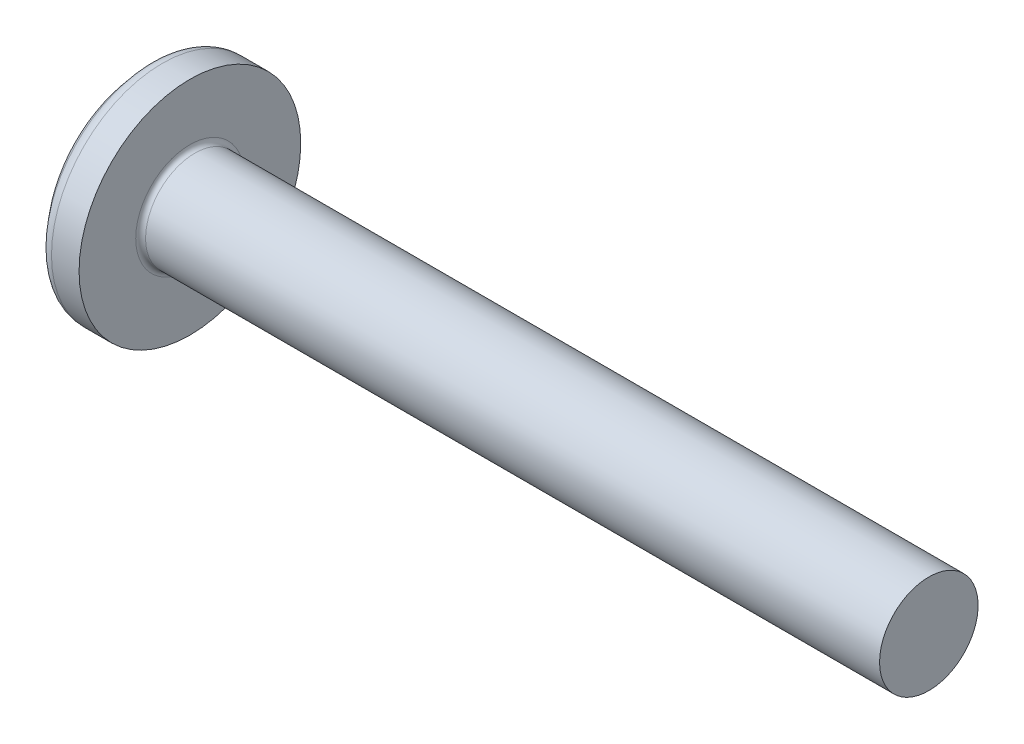
ISO-10303-21;
HEADER;
FILE_DESCRIPTION(('STEP AP214'),'2;1');
FILE_NAME('part.step','',(''),(''),'','','');
FILE_SCHEMA(('AUTOMOTIVE_DESIGN { 1 0 10303 214 1 1 1 1 }'));
ENDSEC;
DATA;
#1=APPLICATION_CONTEXT('core data for automotive mechanical design processes');
#2=APPLICATION_PROTOCOL_DEFINITION('international standard','automotive_design',2000,#1);
#3=PRODUCT_CONTEXT('',#1,'mechanical');
#4=PRODUCT('Part','Part','',(#3));
#5=PRODUCT_RELATED_PRODUCT_CATEGORY('part','',(#4));
#6=PRODUCT_DEFINITION_FORMATION('','',#4);
#7=PRODUCT_DEFINITION_CONTEXT('part definition',#1,'design');
#8=PRODUCT_DEFINITION('design','',#6,#7);
#9=PRODUCT_DEFINITION_SHAPE('','',#8);
#10=(LENGTH_UNIT() NAMED_UNIT(*) SI_UNIT(.MILLI.,.METRE.));
#11=(NAMED_UNIT(*) PLANE_ANGLE_UNIT() SI_UNIT($,.RADIAN.));
#12=(NAMED_UNIT(*) SI_UNIT($,.STERADIAN.) SOLID_ANGLE_UNIT());
#13=UNCERTAINTY_MEASURE_WITH_UNIT(LENGTH_MEASURE(1.E-05),#10,'distance_accuracy_value','');
#14=(GEOMETRIC_REPRESENTATION_CONTEXT(3) GLOBAL_UNCERTAINTY_ASSIGNED_CONTEXT((#13)) GLOBAL_UNIT_ASSIGNED_CONTEXT((#10,
#11,#12)) REPRESENTATION_CONTEXT('',''));
#15=CARTESIAN_POINT('',(0.,0.,0.));
#16=DIRECTION('',(0.,0.,1.));
#17=DIRECTION('',(1.,0.,0.));
#18=AXIS2_PLACEMENT_3D('',#15,#16,#17);
#19=CARTESIAN_POINT('',(3.2,0.,0.));
#20=DIRECTION('',(-1.,0.,0.));
#21=DIRECTION('',(0.,1.,0.));
#22=AXIS2_PLACEMENT_3D('',#19,#20,#21);
#23=SPHERICAL_SURFACE('',#22,3.2);
#24=CARTESIAN_POINT('',(0.841233741586119,0.,0.));
#25=DIRECTION('',(-1.,0.,0.));
#26=DIRECTION('',(0.,0.,1.));
#27=AXIS2_PLACEMENT_3D('',#24,#25,#26);
#28=CIRCLE('',#27,2.16245733788396);
#29=CARTESIAN_POINT('',(0.841233741586119,0.,2.16245733788396));
#30=VERTEX_POINT('',#29);
#31=EDGE_CURVE('E237',#30,#30,#28,.T.);
#32=ORIENTED_EDGE('',*,*,#31,.T.);
#33=EDGE_LOOP('',(#32));
#34=FACE_BOUND('',#33,.T.);
#35=CARTESIAN_POINT('',(0.0716483709574333,0.,0.));
#36=DIRECTION('',(1.,0.,0.));
#37=DIRECTION('',(0.,0.,-1.));
#38=AXIS2_PLACEMENT_3D('',#35,#36,#37);
#39=CIRCLE('',#38,0.673361778739132);
#40=CARTESIAN_POINT('',(0.0716483709574344,-0.369999999999998,-0.562597622699144));
#41=VERTEX_POINT('',#40);
#42=CARTESIAN_POINT('',(0.0716483709574333,-0.56259762269914,-0.37));
#43=VERTEX_POINT('',#42);
#44=EDGE_CURVE('E373',#41,#43,#39,.F.);
#45=ORIENTED_EDGE('',*,*,#44,.F.);
#46=CARTESIAN_POINT('',(3.2,-0.37,0.));
#47=DIRECTION('',(0.,1.,0.));
#48=DIRECTION('',(0.,0.,1.));
#49=AXIS2_PLACEMENT_3D('',#46,#47,#48);
#50=CIRCLE('',#49,3.17853739949682);
#51=CARTESIAN_POINT('',(0.155263655884902,-0.369999999999996,-0.912513339532436));
#52=VERTEX_POINT('',#51);
#53=EDGE_CURVE('E299',#52,#41,#50,.T.);
#54=ORIENTED_EDGE('',*,*,#53,.F.);
#55=CARTESIAN_POINT('',(3.24047110948155,0.,-0.16762475871276));
#56=DIRECTION('',(0.234695116100391,0.,-0.972069031745495));
#57=DIRECTION('',(-0.972069031745495,0.,-0.234695116100391));
#58=AXIS2_PLACEMENT_3D('',#55,#56,#57);
#59=CIRCLE('',#58,3.19535037665102);
#60=CARTESIAN_POINT('',(0.155263655884902,0.370000000000003,-0.912513339532433));
#61=VERTEX_POINT('',#60);
#62=EDGE_CURVE('E271',#52,#61,#59,.T.);
#63=ORIENTED_EDGE('',*,*,#62,.T.);
#64=CARTESIAN_POINT('',(3.2,0.37,0.));
#65=DIRECTION('',(0.,-1.,0.));
#66=DIRECTION('',(0.,0.,-1.));
#67=AXIS2_PLACEMENT_3D('',#64,#65,#66);
#68=CIRCLE('',#67,3.17853739949682);
#69=CARTESIAN_POINT('',(0.0716483709574348,0.370000000000002,-0.562597622699142));
#70=VERTEX_POINT('',#69);
#71=EDGE_CURVE('E326',#70,#61,#68,.T.);
#72=ORIENTED_EDGE('',*,*,#71,.F.);
#73=CARTESIAN_POINT('',(0.0716483709574333,0.562597622699138,-0.37));
#74=VERTEX_POINT('',#73);
#75=EDGE_CURVE('E392',#74,#70,#39,.F.);
#76=ORIENTED_EDGE('',*,*,#75,.F.);
#77=CARTESIAN_POINT('',(3.2,0.,-0.37));
#78=DIRECTION('',(0.,0.,1.));
#79=DIRECTION('',(0.,-1.,0.));
#80=AXIS2_PLACEMENT_3D('',#77,#78,#79);
#81=CIRCLE('',#80,3.17853739949682);
#82=CARTESIAN_POINT('',(0.155263655884903,0.912513339532434,-0.37));
#83=VERTEX_POINT('',#82);
#84=EDGE_CURVE('E265',#83,#74,#81,.T.);
#85=ORIENTED_EDGE('',*,*,#84,.F.);
#86=CARTESIAN_POINT('',(3.24047110948155,0.167624758712761,0.));
#87=DIRECTION('',(0.234695116100391,0.972069031745495,0.));
#88=DIRECTION('',(-0.972069031745495,0.234695116100391,0.));
#89=AXIS2_PLACEMENT_3D('',#86,#87,#88);
#90=CIRCLE('',#89,3.19535037665102);
#91=CARTESIAN_POINT('',(0.155263655884903,0.912513339532434,0.37));
#92=VERTEX_POINT('',#91);
#93=EDGE_CURVE('E268',#83,#92,#90,.T.);
#94=ORIENTED_EDGE('',*,*,#93,.T.);
#95=CARTESIAN_POINT('',(3.2,0.,0.37));
#96=DIRECTION('',(0.,0.,-1.));
#97=DIRECTION('',(0.,1.,0.));
#98=AXIS2_PLACEMENT_3D('',#95,#96,#97);
#99=CIRCLE('',#98,3.17853739949682);
#100=CARTESIAN_POINT('',(0.0716483709574331,0.562597622699138,0.37));
#101=VERTEX_POINT('',#100);
#102=EDGE_CURVE('E261',#101,#92,#99,.T.);
#103=ORIENTED_EDGE('',*,*,#102,.F.);
#104=CARTESIAN_POINT('',(0.0716483709574347,0.369999999999998,0.562597622699144));
#105=VERTEX_POINT('',#104);
#106=EDGE_CURVE('E391',#105,#101,#39,.F.);
#107=ORIENTED_EDGE('',*,*,#106,.F.);
#108=CARTESIAN_POINT('',(0.155263655884903,0.369999999999997,0.912513339532436));
#109=VERTEX_POINT('',#108);
#110=EDGE_CURVE('E281',#109,#105,#68,.T.);
#111=ORIENTED_EDGE('',*,*,#110,.F.);
#112=CARTESIAN_POINT('',(3.24047110948155,0.,0.167624758712761));
#113=DIRECTION('',(0.234695116100391,0.,0.972069031745495));
#114=DIRECTION('',(0.972069031745495,0.,-0.234695116100391));
#115=AXIS2_PLACEMENT_3D('',#112,#113,#114);
#116=CIRCLE('',#115,3.19535037665102);
#117=CARTESIAN_POINT('',(0.155263655884903,-0.370000000000003,0.912513339532433));
#118=VERTEX_POINT('',#117);
#119=EDGE_CURVE('E48',#109,#118,#116,.T.);
#120=ORIENTED_EDGE('',*,*,#119,.T.);
#121=CARTESIAN_POINT('',(0.0716483709574333,-0.370000000000002,0.562597622699142));
#122=VERTEX_POINT('',#121);
#123=EDGE_CURVE('E278',#122,#118,#50,.T.);
#124=ORIENTED_EDGE('',*,*,#123,.F.);
#125=CARTESIAN_POINT('',(0.0716483709574331,-0.562597622699141,0.37));
#126=VERTEX_POINT('',#125);
#127=EDGE_CURVE('E431',#126,#122,#39,.F.);
#128=ORIENTED_EDGE('',*,*,#127,.F.);
#129=CARTESIAN_POINT('',(0.155263655884902,-0.912513339532435,0.37));
#130=VERTEX_POINT('',#129);
#131=EDGE_CURVE('E262',#130,#126,#99,.T.);
#132=ORIENTED_EDGE('',*,*,#131,.F.);
#133=CARTESIAN_POINT('',(3.24047110948155,-0.16762475871276,0.));
#134=DIRECTION('',(0.234695116100391,-0.972069031745495,0.));
#135=DIRECTION('',(0.972069031745495,0.234695116100391,0.));
#136=AXIS2_PLACEMENT_3D('',#133,#134,#135);
#137=CIRCLE('',#136,3.19535037665102);
#138=CARTESIAN_POINT('',(0.155263655884902,-0.912513339532435,-0.37));
#139=VERTEX_POINT('',#138);
#140=EDGE_CURVE('E258',#130,#139,#137,.T.);
#141=ORIENTED_EDGE('',*,*,#140,.T.);
#142=EDGE_CURVE('E63',#43,#139,#81,.T.);
#143=ORIENTED_EDGE('',*,*,#142,.F.);
#144=EDGE_LOOP('',(#45,#54,#63,#72,#76,#85,#94,#103,#107,#111,#120,#124,#128,#132,#141,#143));
#145=FACE_BOUND('',#144,.T.);
#146=ADVANCED_FACE('F34',(#34,#145),#23,.T.);
#147=CARTESIAN_POINT('',(1.75,0.527482216012805,-0.37));
#148=DIRECTION('',(0.,0.,1.));
#149=DIRECTION('',(0.,-1.,0.));
#150=AXIS2_PLACEMENT_3D('',#147,#148,#149);
#151=PLANE('',#150);
#152=ORIENTED_EDGE('',*,*,#84,.T.);
#153=CARTESIAN_POINT('',(-0.971955343485117,0.648166569542613,-0.37));
#154=CARTESIAN_POINT('',(-0.766872339906306,0.631647215248839,-0.37));
#155=CARTESIAN_POINT('',(-0.561800537744921,0.614985954006993,-0.37));
#156=CARTESIAN_POINT('',(-0.151684936613222,0.581268086432697,-0.37));
#157=CARTESIAN_POINT('',(0.0533588616427454,0.564211471421141,-0.37));
#158=CARTESIAN_POINT('',(0.46340379477237,0.529592085215681,-0.37));
#159=CARTESIAN_POINT('',(0.668404929655617,0.512029314135658,-0.37));
#160=CARTESIAN_POINT('',(1.07834476711651,0.476219235115829,-0.37));
#161=CARTESIAN_POINT('',(1.28328347054799,0.457971937004436,-0.37));
#162=CARTESIAN_POINT('',(1.62132593757562,0.427064177525296,-0.37));
#163=CARTESIAN_POINT('',(1.75445532896078,0.414684782153032,-0.37));
#164=CARTESIAN_POINT('',(2.0206619047459,0.38938526299754,-0.37));
#165=CARTESIAN_POINT('',(2.15373908948519,0.376465142789697,-0.37));
#166=CARTESIAN_POINT('',(2.41982964805089,0.349910280247217,-0.37));
#167=CARTESIAN_POINT('',(2.55284301841975,0.336275502822232,-0.37));
#168=CARTESIAN_POINT('',(2.81875830544936,0.307934122969144,-0.37));
#169=CARTESIAN_POINT('',(2.95166021932249,0.293227494496791,-0.37));
#170=CARTESIAN_POINT('',(3.08448262161282,0.277806366268736,-0.37));
#171=B_SPLINE_CURVE_WITH_KNOTS('',3,(#153,#154,#155,#156,#157,#158,#159,#160,#161,#162,#163,
#164,#165,#166,#167,#168,#169,#170),.UNSPECIFIED.,.F.,.F.,(4,2,2,2,2,2,2,2,4),(0.,
0.617242024568861,1.23449761215873,1.85175306087086,2.46899965044083,2.87010992407901,
3.27121754591138,3.67234488099182,4.07348196607046),.UNSPECIFIED.);
#172=CARTESIAN_POINT('',(1.75,0.415013252800437,-0.370000000000001));
#173=VERTEX_POINT('',#172);
#174=EDGE_CURVE('E415',#74,#173,#171,.T.);
#175=ORIENTED_EDGE('',*,*,#174,.T.);
#176=DIRECTION('',(0.,1.,0.));
#177=VECTOR('',#176,1.);
#178=CARTESIAN_POINT('',(1.75,-0.527482216012805,-0.37));
#179=LINE('',#178,#177);
#180=CARTESIAN_POINT('',(1.75,0.527482216012805,-0.37));
#181=VERTEX_POINT('',#180);
#182=EDGE_CURVE('E355',#173,#181,#179,.T.);
#183=ORIENTED_EDGE('',*,*,#182,.T.);
#184=DIRECTION('',(0.972069031745495,-0.234695116100391,0.));
#185=VECTOR('',#184,1.);
#186=CARTESIAN_POINT('',(0.,0.95,-0.37));
#187=LINE('',#186,#185);
#188=EDGE_CURVE('E238',#83,#181,#187,.T.);
#189=ORIENTED_EDGE('',*,*,#188,.F.);
#190=EDGE_LOOP('',(#152,#175,#183,#189));
#191=FACE_BOUND('',#190,.T.);
#192=ADVANCED_FACE('F193',(#191),#151,.T.);
#193=CARTESIAN_POINT('',(1.75,-0.527482216012805,-0.37));
#194=VERTEX_POINT('',#193);
#195=CARTESIAN_POINT('',(1.75,-0.415013252800437,-0.37));
#196=VERTEX_POINT('',#195);
#197=EDGE_CURVE('E246',#194,#196,#179,.T.);
#198=ORIENTED_EDGE('',*,*,#197,.T.);
#199=CARTESIAN_POINT('',(-0.971955343498186,-0.648166569543665,-0.37));
#200=CARTESIAN_POINT('',(-0.766872339917982,-0.631647215249786,-0.37));
#201=CARTESIAN_POINT('',(-0.561800537755202,-0.614985954007833,-0.37));
#202=CARTESIAN_POINT('',(-0.151684936620716,-0.581268086433319,-0.37));
#203=CARTESIAN_POINT('',(0.0533588616366446,-0.564211471421652,-0.37));
#204=CARTESIAN_POINT('',(0.463403794770736,-0.529592085215823,-0.37));
#205=CARTESIAN_POINT('',(0.668404929657056,-0.512029314135538,-0.37));
#206=CARTESIAN_POINT('',(1.0783447671241,-0.476219235115161,-0.37));
#207=CARTESIAN_POINT('',(1.28328347055865,-0.457971937003484,-0.37));
#208=CARTESIAN_POINT('',(1.62132593758934,-0.427064177524027,-0.37));
#209=CARTESIAN_POINT('',(1.75445532897451,-0.414684782151747,-0.37));
#210=CARTESIAN_POINT('',(2.02066190475962,-0.389385262996217,-0.37));
#211=CARTESIAN_POINT('',(2.15373908949891,-0.376465142788354,-0.37));
#212=CARTESIAN_POINT('',(2.4198296480646,-0.349910280245823,-0.37));
#213=CARTESIAN_POINT('',(2.55284301843346,-0.336275502820809,-0.37));
#214=CARTESIAN_POINT('',(2.81875830546307,-0.307934122967648,-0.37));
#215=CARTESIAN_POINT('',(2.95166021933619,-0.293227494495251,-0.37));
#216=CARTESIAN_POINT('',(3.08448262162651,-0.277806366267142,-0.37));
#217=B_SPLINE_CURVE_WITH_KNOTS('',3,(#199,#200,#201,#202,#203,#204,#205,#206,#207,#208,#209,
#210,#211,#212,#213,#214,#215,#216),.UNSPECIFIED.,.F.,.F.,(4,2,2,2,2,2,2,2,4),(0.,
0.617242024573054,1.23449761216712,1.8517530608885,2.46899965046773,2.8701099241059,
3.27121754593828,3.67234488101871,4.07348196609735),.UNSPECIFIED.);
#218=EDGE_CURVE('E390',#196,#43,#217,.F.);
#219=ORIENTED_EDGE('',*,*,#218,.T.);
#220=ORIENTED_EDGE('',*,*,#142,.T.);
#221=DIRECTION('',(0.972069031745495,0.234695116100391,0.));
#222=VECTOR('',#221,1.);
#223=CARTESIAN_POINT('',(0.,-0.95,-0.37));
#224=LINE('',#223,#222);
#225=EDGE_CURVE('E329',#139,#194,#224,.T.);
#226=ORIENTED_EDGE('',*,*,#225,.T.);
#227=EDGE_LOOP('',(#198,#219,#220,#226));
#228=FACE_BOUND('',#227,.T.);
#229=ADVANCED_FACE('F199',(#228),#151,.T.);
#230=CARTESIAN_POINT('',(0.,-0.95,0.37));
#231=DIRECTION('',(0.,0.,-1.));
#232=DIRECTION('',(0.,1.,0.));
#233=AXIS2_PLACEMENT_3D('',#230,#231,#232);
#234=PLANE('',#233);
#235=DIRECTION('',(0.,-1.,0.));
#236=VECTOR('',#235,1.);
#237=CARTESIAN_POINT('',(1.75,0.527482216012805,0.37));
#238=LINE('',#237,#236);
#239=CARTESIAN_POINT('',(1.75,0.527482216012805,0.37));
#240=VERTEX_POINT('',#239);
#241=CARTESIAN_POINT('',(1.75,0.415013252800437,0.37));
#242=VERTEX_POINT('',#241);
#243=EDGE_CURVE('E338',#240,#242,#238,.T.);
#244=ORIENTED_EDGE('',*,*,#243,.T.);
#245=CARTESIAN_POINT('',(-0.971955343498186,0.648166569543665,0.37));
#246=CARTESIAN_POINT('',(-0.766872339917981,0.631647215249786,0.37));
#247=CARTESIAN_POINT('',(-0.561800537755202,0.614985954007833,0.37));
#248=CARTESIAN_POINT('',(-0.151684936620716,0.581268086433319,0.37));
#249=CARTESIAN_POINT('',(0.0533588616366447,0.564211471421652,0.37));
#250=CARTESIAN_POINT('',(0.463403794770737,0.529592085215823,0.37));
#251=CARTESIAN_POINT('',(0.668404929657057,0.512029314135538,0.37));
#252=CARTESIAN_POINT('',(1.0783447671241,0.476219235115161,0.37));
#253=CARTESIAN_POINT('',(1.28328347055865,0.457971937003484,0.37));
#254=CARTESIAN_POINT('',(1.62132593758934,0.427064177524027,0.37));
#255=CARTESIAN_POINT('',(1.75445532897451,0.414684782151747,0.37));
#256=CARTESIAN_POINT('',(2.02066190475962,0.389385262996217,0.37));
#257=CARTESIAN_POINT('',(2.15373908949891,0.376465142788354,0.37));
#258=CARTESIAN_POINT('',(2.4198296480646,0.349910280245823,0.37));
#259=CARTESIAN_POINT('',(2.55284301843346,0.336275502820809,0.37));
#260=CARTESIAN_POINT('',(2.81875830546307,0.307934122967648,0.37));
#261=CARTESIAN_POINT('',(2.95166021933619,0.293227494495251,0.37));
#262=CARTESIAN_POINT('',(3.08448262162651,0.277806366267142,0.37));
#263=B_SPLINE_CURVE_WITH_KNOTS('',3,(#245,#246,#247,#248,#249,#250,#251,#252,#253,#254,#255,
#256,#257,#258,#259,#260,#261,#262),.UNSPECIFIED.,.F.,.F.,(4,2,2,2,2,2,2,2,4),(0.,
0.617242024573054,1.23449761216712,1.8517530608885,2.46899965046773,2.8701099241059,
3.27121754593828,3.67234488101871,4.07348196609735),.UNSPECIFIED.);
#264=EDGE_CURVE('E668',#242,#101,#263,.F.);
#265=ORIENTED_EDGE('',*,*,#264,.T.);
#266=ORIENTED_EDGE('',*,*,#102,.T.);
#267=DIRECTION('',(0.972069031745495,-0.234695116100391,0.));
#268=VECTOR('',#267,1.);
#269=CARTESIAN_POINT('',(0.,0.95,0.37));
#270=LINE('',#269,#268);
#271=EDGE_CURVE('E243',#92,#240,#270,.T.);
#272=ORIENTED_EDGE('',*,*,#271,.T.);
#273=EDGE_LOOP('',(#244,#265,#266,#272));
#274=FACE_BOUND('',#273,.T.);
#275=ADVANCED_FACE('F411',(#274),#234,.T.);
#276=ORIENTED_EDGE('',*,*,#131,.T.);
#277=CARTESIAN_POINT('',(-0.971955343498186,-0.648166569543665,0.37));
#278=CARTESIAN_POINT('',(-0.766872339917981,-0.631647215249786,0.37));
#279=CARTESIAN_POINT('',(-0.561800537755202,-0.614985954007833,0.37));
#280=CARTESIAN_POINT('',(-0.151684936620716,-0.581268086433319,0.37));
#281=CARTESIAN_POINT('',(0.0533588616366447,-0.564211471421652,0.37));
#282=CARTESIAN_POINT('',(0.463403794770737,-0.529592085215823,0.37));
#283=CARTESIAN_POINT('',(0.668404929657056,-0.512029314135538,0.37));
#284=CARTESIAN_POINT('',(1.0783447671241,-0.476219235115162,0.37));
#285=CARTESIAN_POINT('',(1.28328347055865,-0.457971937003484,0.37));
#286=CARTESIAN_POINT('',(1.62132593758934,-0.427064177524027,0.37));
#287=CARTESIAN_POINT('',(1.75445532897451,-0.414684782151747,0.37));
#288=CARTESIAN_POINT('',(2.02066190475962,-0.389385262996217,0.37));
#289=CARTESIAN_POINT('',(2.15373908949891,-0.376465142788354,0.37));
#290=CARTESIAN_POINT('',(2.4198296480646,-0.349910280245823,0.37));
#291=CARTESIAN_POINT('',(2.55284301843346,-0.336275502820809,0.37));
#292=CARTESIAN_POINT('',(2.81875830546307,-0.307934122967648,0.37));
#293=CARTESIAN_POINT('',(2.95166021933619,-0.293227494495252,0.37));
#294=CARTESIAN_POINT('',(3.08448262162651,-0.277806366267142,0.37));
#295=B_SPLINE_CURVE_WITH_KNOTS('',3,(#277,#278,#279,#280,#281,#282,#283,#284,#285,#286,#287,
#288,#289,#290,#291,#292,#293,#294),.UNSPECIFIED.,.F.,.F.,(4,2,2,2,2,2,2,2,4),(0.,
0.617242024573054,1.23449761216712,1.8517530608885,2.46899965046773,2.8701099241059,
3.27121754593828,3.67234488101871,4.07348196609735),.UNSPECIFIED.);
#296=CARTESIAN_POINT('',(1.75,-0.415013252800438,0.37));
#297=VERTEX_POINT('',#296);
#298=EDGE_CURVE('E432',#126,#297,#295,.T.);
#299=ORIENTED_EDGE('',*,*,#298,.T.);
#300=CARTESIAN_POINT('',(1.75,-0.527482216012805,0.37));
#301=VERTEX_POINT('',#300);
#302=EDGE_CURVE('E340',#297,#301,#238,.T.);
#303=ORIENTED_EDGE('',*,*,#302,.T.);
#304=DIRECTION('',(0.972069031745495,0.234695116100391,0.));
#305=VECTOR('',#304,1.);
#306=CARTESIAN_POINT('',(0.,-0.95,0.37));
#307=LINE('',#306,#305);
#308=EDGE_CURVE('E331',#130,#301,#307,.T.);
#309=ORIENTED_EDGE('',*,*,#308,.F.);
#310=EDGE_LOOP('',(#276,#299,#303,#309));
#311=FACE_BOUND('',#310,.T.);
#312=ADVANCED_FACE('F524',(#311),#234,.T.);
#313=CARTESIAN_POINT('',(1.75,0.527482216012805,0.37));
#314=DIRECTION('',(0.234695116100391,0.972069031745495,0.));
#315=DIRECTION('',(-0.972069031745495,0.234695116100391,0.));
#316=AXIS2_PLACEMENT_3D('',#313,#314,#315);
#317=PLANE('',#316);
#318=CARTESIAN_POINT('',(3.40675133188542,0.127478272375057,0.));
#319=DIRECTION('',(0.234695116100391,0.972069031745495,0.));
#320=DIRECTION('',(-0.972069031745495,0.234695116100391,0.));
#321=AXIS2_PLACEMENT_3D('',#318,#319,#320);
#322=ELLIPSE('',#321,1.87540613750916,0.421283911405532);
#323=CARTESIAN_POINT('',(1.75,0.527482216012806,0.175779725196677));
#324=VERTEX_POINT('',#323);
#325=CARTESIAN_POINT('',(1.75,0.527482216012806,-0.175779725196677));
#326=VERTEX_POINT('',#325);
#327=EDGE_CURVE('E304',#324,#326,#322,.F.);
#328=ORIENTED_EDGE('',*,*,#327,.F.);
#329=DIRECTION('',(0.,0.,-1.));
#330=VECTOR('',#329,1.);
#331=CARTESIAN_POINT('',(1.75,0.527482216012805,0.37));
#332=LINE('',#331,#330);
#333=EDGE_CURVE('E341',#240,#324,#332,.T.);
#334=ORIENTED_EDGE('',*,*,#333,.F.);
#335=ORIENTED_EDGE('',*,*,#271,.F.);
#336=ORIENTED_EDGE('',*,*,#93,.F.);
#337=ORIENTED_EDGE('',*,*,#188,.T.);
#338=EDGE_CURVE('E343',#326,#181,#332,.T.);
#339=ORIENTED_EDGE('',*,*,#338,.F.);
#340=EDGE_LOOP('',(#328,#334,#335,#336,#337,#339));
#341=FACE_BOUND('',#340,.T.);
#342=ADVANCED_FACE('F409',(#341),#317,.F.);
#343=CARTESIAN_POINT('',(1.75,-0.527482216012805,-0.37));
#344=DIRECTION('',(0.234695116100391,-0.972069031745495,0.));
#345=DIRECTION('',(0.972069031745495,0.234695116100391,0.));
#346=AXIS2_PLACEMENT_3D('',#343,#344,#345);
#347=PLANE('',#346);
#348=CARTESIAN_POINT('',(3.40675133188542,-0.127478272375056,0.));
#349=DIRECTION('',(0.234695116100391,-0.972069031745495,0.));
#350=DIRECTION('',(-0.972069031745495,-0.234695116100391,0.));
#351=AXIS2_PLACEMENT_3D('',#348,#349,#350);
#352=ELLIPSE('',#351,1.87540613750917,0.421283911405533);
#353=CARTESIAN_POINT('',(1.75,-0.527482216012806,-0.175779725196679));
#354=VERTEX_POINT('',#353);
#355=CARTESIAN_POINT('',(1.75,-0.527482216012806,0.175779725196679));
#356=VERTEX_POINT('',#355);
#357=EDGE_CURVE('E670',#354,#356,#352,.F.);
#358=ORIENTED_EDGE('',*,*,#357,.F.);
#359=DIRECTION('',(0.,0.,1.));
#360=VECTOR('',#359,1.);
#361=CARTESIAN_POINT('',(1.75,-0.527482216012805,-0.37));
#362=LINE('',#361,#360);
#363=EDGE_CURVE('E334',#194,#354,#362,.T.);
#364=ORIENTED_EDGE('',*,*,#363,.F.);
#365=ORIENTED_EDGE('',*,*,#225,.F.);
#366=ORIENTED_EDGE('',*,*,#140,.F.);
#367=ORIENTED_EDGE('',*,*,#308,.T.);
#368=EDGE_CURVE('E337',#356,#301,#362,.T.);
#369=ORIENTED_EDGE('',*,*,#368,.F.);
#370=EDGE_LOOP('',(#358,#364,#365,#366,#367,#369));
#371=FACE_BOUND('',#370,.T.);
#372=ADVANCED_FACE('F511',(#371),#347,.F.);
#373=CARTESIAN_POINT('',(1.75,0.527482216012805,-0.37));
#374=DIRECTION('',(-1.,0.,0.));
#375=DIRECTION('',(0.,0.,1.));
#376=AXIS2_PLACEMENT_3D('',#373,#374,#375);
#377=PLANE('',#376);
#378=DIRECTION('',(0.,1.,0.));
#379=VECTOR('',#378,1.);
#380=CARTESIAN_POINT('',(1.75,-0.370000000000002,0.527482216012804));
#381=LINE('',#380,#379);
#382=CARTESIAN_POINT('',(1.75,-0.370000000000002,0.527482216012804));
#383=VERTEX_POINT('',#382);
#384=CARTESIAN_POINT('',(1.75,-0.175779725196681,0.527482216012805));
#385=VERTEX_POINT('',#384);
#386=EDGE_CURVE('E319',#383,#385,#381,.T.);
#387=ORIENTED_EDGE('',*,*,#386,.T.);
#388=CARTESIAN_POINT('',(1.75,0.,0.));
#389=DIRECTION('',(-1.,0.,0.));
#390=DIRECTION('',(0.,0.,1.));
#391=AXIS2_PLACEMENT_3D('',#388,#389,#390);
#392=CIRCLE('',#391,0.556);
#393=CARTESIAN_POINT('',(1.75,-0.370000000000001,0.415013252800437));
#394=VERTEX_POINT('',#393);
#395=EDGE_CURVE('E698',#394,#385,#392,.T.);
#396=ORIENTED_EDGE('',*,*,#395,.F.);
#397=DIRECTION('',(0.,0.,-1.));
#398=VECTOR('',#397,1.);
#399=CARTESIAN_POINT('',(1.75,-0.370000000000002,0.527482216012804));
#400=LINE('',#399,#398);
#401=EDGE_CURVE('E315',#383,#394,#400,.T.);
#402=ORIENTED_EDGE('',*,*,#401,.F.);
#403=EDGE_LOOP('',(#387,#396,#402));
#404=FACE_BOUND('',#403,.T.);
#405=ADVANCED_FACE('F468',(#404),#377,.T.);
#406=ORIENTED_EDGE('',*,*,#302,.F.);
#407=EDGE_CURVE('E703',#356,#297,#392,.T.);
#408=ORIENTED_EDGE('',*,*,#407,.F.);
#409=ORIENTED_EDGE('',*,*,#368,.T.);
#410=EDGE_LOOP('',(#406,#408,#409));
#411=FACE_BOUND('',#410,.T.);
#412=ADVANCED_FACE('F498',(#411),#377,.T.);
#413=ORIENTED_EDGE('',*,*,#363,.T.);
#414=EDGE_CURVE('E384',#196,#354,#392,.T.);
#415=ORIENTED_EDGE('',*,*,#414,.F.);
#416=ORIENTED_EDGE('',*,*,#197,.F.);
#417=EDGE_LOOP('',(#413,#415,#416));
#418=FACE_BOUND('',#417,.T.);
#419=ADVANCED_FACE('F492',(#418),#377,.T.);
#420=CARTESIAN_POINT('',(1.75,-0.369999999999998,-0.415013252800438));
#421=VERTEX_POINT('',#420);
#422=CARTESIAN_POINT('',(1.75,-0.369999999999998,-0.527482216012806));
#423=VERTEX_POINT('',#422);
#424=EDGE_CURVE('E318',#421,#423,#400,.T.);
#425=ORIENTED_EDGE('',*,*,#424,.F.);
#426=CARTESIAN_POINT('',(1.75,-0.175779725196679,-0.527482216012806));
#427=VERTEX_POINT('',#426);
#428=EDGE_CURVE('E55',#427,#421,#392,.T.);
#429=ORIENTED_EDGE('',*,*,#428,.F.);
#430=DIRECTION('',(0.,-1.,0.));
#431=VECTOR('',#430,1.);
#432=CARTESIAN_POINT('',(1.75,0.370000000000002,-0.527482216012803));
#433=LINE('',#432,#431);
#434=EDGE_CURVE('E314',#427,#423,#433,.T.);
#435=ORIENTED_EDGE('',*,*,#434,.T.);
#436=EDGE_LOOP('',(#425,#429,#435));
#437=FACE_BOUND('',#436,.T.);
#438=ADVANCED_FACE('F379',(#437),#377,.T.);
#439=CARTESIAN_POINT('',(1.75,0.370000000000002,-0.527482216012803));
#440=VERTEX_POINT('',#439);
#441=CARTESIAN_POINT('',(1.75,0.175779725196683,-0.527482216012804));
#442=VERTEX_POINT('',#441);
#443=EDGE_CURVE('E311',#440,#442,#433,.T.);
#444=ORIENTED_EDGE('',*,*,#443,.T.);
#445=CARTESIAN_POINT('',(1.75,0.370000000000001,-0.415013252800437));
#446=VERTEX_POINT('',#445);
#447=EDGE_CURVE('E383',#446,#442,#392,.T.);
#448=ORIENTED_EDGE('',*,*,#447,.F.);
#449=DIRECTION('',(0.,0.,1.));
#450=VECTOR('',#449,1.);
#451=CARTESIAN_POINT('',(1.75,0.370000000000002,-0.527482216012803));
#452=LINE('',#451,#450);
#453=EDGE_CURVE('E323',#440,#446,#452,.T.);
#454=ORIENTED_EDGE('',*,*,#453,.F.);
#455=EDGE_LOOP('',(#444,#448,#454));
#456=FACE_BOUND('',#455,.T.);
#457=ADVANCED_FACE('F480',(#456),#377,.T.);
#458=ORIENTED_EDGE('',*,*,#182,.F.);
#459=EDGE_CURVE('E687',#326,#173,#392,.T.);
#460=ORIENTED_EDGE('',*,*,#459,.F.);
#461=ORIENTED_EDGE('',*,*,#338,.T.);
#462=EDGE_LOOP('',(#458,#460,#461));
#463=FACE_BOUND('',#462,.T.);
#464=ADVANCED_FACE('F474',(#463),#377,.T.);
#465=ORIENTED_EDGE('',*,*,#333,.T.);
#466=EDGE_CURVE('E689',#242,#324,#392,.T.);
#467=ORIENTED_EDGE('',*,*,#466,.F.);
#468=ORIENTED_EDGE('',*,*,#243,.F.);
#469=EDGE_LOOP('',(#465,#467,#468));
#470=FACE_BOUND('',#469,.T.);
#471=ADVANCED_FACE('F466',(#470),#377,.T.);
#472=CARTESIAN_POINT('',(1.75,0.369999999999999,0.415013252800439));
#473=VERTEX_POINT('',#472);
#474=CARTESIAN_POINT('',(1.75,0.369999999999998,0.527482216012807));
#475=VERTEX_POINT('',#474);
#476=EDGE_CURVE('E296',#473,#475,#452,.T.);
#477=ORIENTED_EDGE('',*,*,#476,.F.);
#478=CARTESIAN_POINT('',(1.75,0.175779725196678,0.527482216012806));
#479=VERTEX_POINT('',#478);
#480=EDGE_CURVE('E385',#479,#473,#392,.T.);
#481=ORIENTED_EDGE('',*,*,#480,.F.);
#482=EDGE_CURVE('E322',#479,#475,#381,.T.);
#483=ORIENTED_EDGE('',*,*,#482,.T.);
#484=EDGE_LOOP('',(#477,#481,#483));
#485=FACE_BOUND('',#484,.T.);
#486=ADVANCED_FACE('F460',(#485),#377,.T.);
#487=CARTESIAN_POINT('',(1.75,0.369999999999998,0.527482216012807));
#488=DIRECTION('',(0.,-1.,0.));
#489=DIRECTION('',(0.,0.,-1.));
#490=AXIS2_PLACEMENT_3D('',#487,#488,#489);
#491=PLANE('',#490);
#492=ORIENTED_EDGE('',*,*,#110,.T.);
#493=CARTESIAN_POINT('',(-0.971955343498185,0.369999999999998,0.648166569543666));
#494=CARTESIAN_POINT('',(-0.766872339917981,0.369999999999998,0.631647215249787));
#495=CARTESIAN_POINT('',(-0.561800537755202,0.369999999999998,0.614985954007834));
#496=CARTESIAN_POINT('',(-0.151684936620716,0.369999999999998,0.58126808643332));
#497=CARTESIAN_POINT('',(0.0533588616366449,0.369999999999998,0.564211471421653));
#498=CARTESIAN_POINT('',(0.463403794770737,0.369999999999998,0.529592085215824));
#499=CARTESIAN_POINT('',(0.668404929657056,0.369999999999998,0.512029314135539));
#500=CARTESIAN_POINT('',(1.0783447671241,0.369999999999998,0.476219235115163));
#501=CARTESIAN_POINT('',(1.28328347055865,0.369999999999998,0.457971937003486));
#502=CARTESIAN_POINT('',(1.62132593758934,0.369999999999999,0.427064177524028));
#503=CARTESIAN_POINT('',(1.75445532897451,0.369999999999999,0.414684782151748));
#504=CARTESIAN_POINT('',(2.02066190475962,0.369999999999999,0.389385262996218));
#505=CARTESIAN_POINT('',(2.15373908949891,0.369999999999999,0.376465142788355));
#506=CARTESIAN_POINT('',(2.4198296480646,0.369999999999999,0.349910280245824));
#507=CARTESIAN_POINT('',(2.55284301843346,0.369999999999999,0.33627550282081));
#508=CARTESIAN_POINT('',(2.81875830546307,0.369999999999999,0.307934122967649));
#509=CARTESIAN_POINT('',(2.95166021933619,0.369999999999999,0.293227494495252));
#510=CARTESIAN_POINT('',(3.08448262162651,0.369999999999999,0.277806366267143));
#511=B_SPLINE_CURVE_WITH_KNOTS('',3,(#493,#494,#495,#496,#497,#498,#499,#500,#501,#502,#503,
#504,#505,#506,#507,#508,#509,#510),.UNSPECIFIED.,.F.,.F.,(4,2,2,2,2,2,2,2,4),(0.,
0.617242024573054,1.23449761216712,1.8517530608885,2.46899965046773,2.8701099241059,
3.27121754593828,3.67234488101871,4.07348196609735),.UNSPECIFIED.);
#512=EDGE_CURVE('E667',#105,#473,#511,.T.);
#513=ORIENTED_EDGE('',*,*,#512,.T.);
#514=ORIENTED_EDGE('',*,*,#476,.T.);
#515=DIRECTION('',(0.972069031745495,0.,-0.234695116100391));
#516=VECTOR('',#515,1.);
#517=CARTESIAN_POINT('',(0.,0.369999999999997,0.950000000000001));
#518=LINE('',#517,#516);
#519=EDGE_CURVE('E289',#109,#475,#518,.T.);
#520=ORIENTED_EDGE('',*,*,#519,.F.);
#521=EDGE_LOOP('',(#492,#513,#514,#520));
#522=FACE_BOUND('',#521,.T.);
#523=ADVANCED_FACE('F293',(#522),#491,.T.);
#524=CARTESIAN_POINT('',(0.,-0.369999999999996,-0.950000000000001));
#525=DIRECTION('',(0.,1.,0.));
#526=DIRECTION('',(0.,0.,1.));
#527=AXIS2_PLACEMENT_3D('',#524,#525,#526);
#528=PLANE('',#527);
#529=ORIENTED_EDGE('',*,*,#401,.T.);
#530=CARTESIAN_POINT('',(-0.971955343485117,-0.370000000000002,0.648166569542611));
#531=CARTESIAN_POINT('',(-0.766872339906306,-0.370000000000002,0.631647215248838));
#532=CARTESIAN_POINT('',(-0.561800537744921,-0.370000000000002,0.614985954006992));
#533=CARTESIAN_POINT('',(-0.151684936613222,-0.370000000000002,0.581268086432695));
#534=CARTESIAN_POINT('',(0.0533588616427447,-0.370000000000002,0.56421147142114));
#535=CARTESIAN_POINT('',(0.46340379477237,-0.370000000000002,0.529592085215679));
#536=CARTESIAN_POINT('',(0.668404929655616,-0.370000000000002,0.512029314135657));
#537=CARTESIAN_POINT('',(1.07834476711651,-0.370000000000001,0.476219235115828));
#538=CARTESIAN_POINT('',(1.28328347054799,-0.370000000000001,0.457971937004435));
#539=CARTESIAN_POINT('',(1.62132593757562,-0.370000000000001,0.427064177525295));
#540=CARTESIAN_POINT('',(1.75445532896078,-0.370000000000001,0.414684782153031));
#541=CARTESIAN_POINT('',(2.0206619047459,-0.370000000000001,0.389385262997539));
#542=CARTESIAN_POINT('',(2.15373908948519,-0.370000000000001,0.376465142789696));
#543=CARTESIAN_POINT('',(2.41982964805089,-0.370000000000001,0.349910280247216));
#544=CARTESIAN_POINT('',(2.55284301841975,-0.370000000000001,0.336275502822231));
#545=CARTESIAN_POINT('',(2.81875830544936,-0.370000000000001,0.307934122969143));
#546=CARTESIAN_POINT('',(2.95166021932249,-0.370000000000001,0.29322749449679));
#547=CARTESIAN_POINT('',(3.08448262161282,-0.370000000000001,0.277806366268735));
#548=B_SPLINE_CURVE_WITH_KNOTS('',3,(#530,#531,#532,#533,#534,#535,#536,#537,#538,#539,#540,
#541,#542,#543,#544,#545,#546,#547),.UNSPECIFIED.,.F.,.F.,(4,2,2,2,2,2,2,2,4),(0.,
0.617242024568861,1.23449761215873,1.85175306087086,2.46899965044083,2.87010992407901,
3.27121754591138,3.67234488099182,4.07348196607046),.UNSPECIFIED.);
#549=EDGE_CURVE('E424',#394,#122,#548,.F.);
#550=ORIENTED_EDGE('',*,*,#549,.T.);
#551=ORIENTED_EDGE('',*,*,#123,.T.);
#552=DIRECTION('',(0.972069031745495,0.,-0.234695116100391));
#553=VECTOR('',#552,1.);
#554=CARTESIAN_POINT('',(0.,-0.370000000000003,0.949999999999999));
#555=LINE('',#554,#553);
#556=EDGE_CURVE('E291',#118,#383,#555,.T.);
#557=ORIENTED_EDGE('',*,*,#556,.T.);
#558=EDGE_LOOP('',(#529,#550,#551,#557));
#559=FACE_BOUND('',#558,.T.);
#560=ADVANCED_FACE('F228',(#559),#528,.T.);
#561=CARTESIAN_POINT('',(1.75,-0.370000000000002,0.527482216012804));
#562=DIRECTION('',(0.234695116100391,0.,0.972069031745495));
#563=DIRECTION('',(-0.972069031745495,0.,0.234695116100391));
#564=AXIS2_PLACEMENT_3D('',#561,#562,#563);
#565=PLANE('',#564);
#566=CARTESIAN_POINT('',(3.40675133188542,0.,0.127478272375057));
#567=DIRECTION('',(0.234695116100391,0.,0.972069031745495));
#568=DIRECTION('',(-0.972069031745495,0.,0.234695116100391));
#569=AXIS2_PLACEMENT_3D('',#566,#567,#568);
#570=ELLIPSE('',#569,1.87540613750916,0.421283911405532);
#571=EDGE_CURVE('E422',#385,#479,#570,.F.);
#572=ORIENTED_EDGE('',*,*,#571,.F.);
#573=ORIENTED_EDGE('',*,*,#386,.F.);
#574=ORIENTED_EDGE('',*,*,#556,.F.);
#575=ORIENTED_EDGE('',*,*,#119,.F.);
#576=ORIENTED_EDGE('',*,*,#519,.T.);
#577=ORIENTED_EDGE('',*,*,#482,.F.);
#578=EDGE_LOOP('',(#572,#573,#574,#575,#576,#577));
#579=FACE_BOUND('',#578,.T.);
#580=ADVANCED_FACE('F287',(#579),#565,.F.);
#581=CARTESIAN_POINT('',(1.75,0.370000000000002,-0.527482216012803));
#582=DIRECTION('',(0.234695116100391,0.,-0.972069031745495));
#583=DIRECTION('',(0.972069031745495,0.,0.234695116100391));
#584=AXIS2_PLACEMENT_3D('',#581,#582,#583);
#585=PLANE('',#584);
#586=CARTESIAN_POINT('',(3.40675133188542,0.,-0.127478272375056));
#587=DIRECTION('',(0.234695116100391,0.,-0.972069031745495));
#588=DIRECTION('',(-0.972069031745495,0.,-0.234695116100391));
#589=AXIS2_PLACEMENT_3D('',#586,#587,#588);
#590=ELLIPSE('',#589,1.87540613750917,0.421283911405533);
#591=EDGE_CURVE('E377',#442,#427,#590,.F.);
#592=ORIENTED_EDGE('',*,*,#591,.F.);
#593=ORIENTED_EDGE('',*,*,#443,.F.);
#594=DIRECTION('',(0.972069031745495,0.,0.234695116100391));
#595=VECTOR('',#594,1.);
#596=CARTESIAN_POINT('',(0.,0.370000000000003,-0.949999999999999));
#597=LINE('',#596,#595);
#598=EDGE_CURVE('E301',#61,#440,#597,.T.);
#599=ORIENTED_EDGE('',*,*,#598,.F.);
#600=ORIENTED_EDGE('',*,*,#62,.F.);
#601=DIRECTION('',(0.972069031745495,0.,0.234695116100391));
#602=VECTOR('',#601,1.);
#603=CARTESIAN_POINT('',(0.,-0.369999999999996,-0.950000000000001));
#604=LINE('',#603,#602);
#605=EDGE_CURVE('E308',#52,#423,#604,.T.);
#606=ORIENTED_EDGE('',*,*,#605,.T.);
#607=ORIENTED_EDGE('',*,*,#434,.F.);
#608=EDGE_LOOP('',(#592,#593,#599,#600,#606,#607));
#609=FACE_BOUND('',#608,.T.);
#610=ADVANCED_FACE('F368',(#609),#585,.F.);
#611=ORIENTED_EDGE('',*,*,#453,.T.);
#612=CARTESIAN_POINT('',(-0.971955343485117,0.370000000000002,-0.648166569542611));
#613=CARTESIAN_POINT('',(-0.766872339906306,0.370000000000002,-0.631647215248838));
#614=CARTESIAN_POINT('',(-0.561800537744921,0.370000000000002,-0.614985954006992));
#615=CARTESIAN_POINT('',(-0.151684936613222,0.370000000000002,-0.581268086432695));
#616=CARTESIAN_POINT('',(0.0533588616427453,0.370000000000002,-0.56421147142114));
#617=CARTESIAN_POINT('',(0.46340379477237,0.370000000000002,-0.529592085215679));
#618=CARTESIAN_POINT('',(0.668404929655617,0.370000000000002,-0.512029314135657));
#619=CARTESIAN_POINT('',(1.07834476711651,0.370000000000001,-0.476219235115828));
#620=CARTESIAN_POINT('',(1.28328347054799,0.370000000000001,-0.457971937004435));
#621=CARTESIAN_POINT('',(1.62132593757562,0.370000000000001,-0.427064177525295));
#622=CARTESIAN_POINT('',(1.75445532896078,0.370000000000001,-0.414684782153031));
#623=CARTESIAN_POINT('',(2.0206619047459,0.370000000000001,-0.389385262997539));
#624=CARTESIAN_POINT('',(2.15373908948519,0.370000000000001,-0.376465142789696));
#625=CARTESIAN_POINT('',(2.41982964805089,0.370000000000001,-0.349910280247216));
#626=CARTESIAN_POINT('',(2.55284301841975,0.370000000000001,-0.336275502822231));
#627=CARTESIAN_POINT('',(2.81875830544936,0.370000000000001,-0.307934122969142));
#628=CARTESIAN_POINT('',(2.95166021932249,0.370000000000001,-0.29322749449679));
#629=CARTESIAN_POINT('',(3.08448262161282,0.370000000000001,-0.277806366268735));
#630=B_SPLINE_CURVE_WITH_KNOTS('',3,(#612,#613,#614,#615,#616,#617,#618,#619,#620,#621,#622,
#623,#624,#625,#626,#627,#628,#629),.UNSPECIFIED.,.F.,.F.,(4,2,2,2,2,2,2,2,4),(0.,
0.617242024568861,1.23449761215873,1.85175306087086,2.46899965044083,2.87010992407901,
3.27121754591138,3.67234488099182,4.07348196607046),.UNSPECIFIED.);
#631=EDGE_CURVE('E364',#446,#70,#630,.F.);
#632=ORIENTED_EDGE('',*,*,#631,.T.);
#633=ORIENTED_EDGE('',*,*,#71,.T.);
#634=ORIENTED_EDGE('',*,*,#598,.T.);
#635=EDGE_LOOP('',(#611,#632,#633,#634));
#636=FACE_BOUND('',#635,.T.);
#637=ADVANCED_FACE('F226',(#636),#491,.T.);
#638=ORIENTED_EDGE('',*,*,#53,.T.);
#639=CARTESIAN_POINT('',(-0.971955343498186,-0.369999999999997,-0.648166569543666));
#640=CARTESIAN_POINT('',(-0.766872339917981,-0.369999999999998,-0.631647215249787));
#641=CARTESIAN_POINT('',(-0.561800537755202,-0.369999999999998,-0.614985954007835));
#642=CARTESIAN_POINT('',(-0.151684936620716,-0.369999999999998,-0.58126808643332));
#643=CARTESIAN_POINT('',(0.0533588616366446,-0.369999999999998,-0.564211471421654));
#644=CARTESIAN_POINT('',(0.463403794770736,-0.369999999999998,-0.529592085215824));
#645=CARTESIAN_POINT('',(0.668404929657056,-0.369999999999998,-0.512029314135539));
#646=CARTESIAN_POINT('',(1.0783447671241,-0.369999999999998,-0.476219235115163));
#647=CARTESIAN_POINT('',(1.28328347055864,-0.369999999999998,-0.457971937003486));
#648=CARTESIAN_POINT('',(1.62132593758934,-0.369999999999998,-0.427064177524029));
#649=CARTESIAN_POINT('',(1.75445532897451,-0.369999999999998,-0.414684782151748));
#650=CARTESIAN_POINT('',(2.02066190475962,-0.369999999999998,-0.389385262996219));
#651=CARTESIAN_POINT('',(2.15373908949891,-0.369999999999998,-0.376465142788355));
#652=CARTESIAN_POINT('',(2.4198296480646,-0.369999999999998,-0.349910280245824));
#653=CARTESIAN_POINT('',(2.55284301843346,-0.369999999999998,-0.33627550282081));
#654=CARTESIAN_POINT('',(2.81875830546307,-0.369999999999999,-0.307934122967649));
#655=CARTESIAN_POINT('',(2.95166021933619,-0.369999999999999,-0.293227494495253));
#656=CARTESIAN_POINT('',(3.08448262162651,-0.369999999999999,-0.277806366267144));
#657=B_SPLINE_CURVE_WITH_KNOTS('',3,(#639,#640,#641,#642,#643,#644,#645,#646,#647,#648,#649,
#650,#651,#652,#653,#654,#655,#656),.UNSPECIFIED.,.F.,.F.,(4,2,2,2,2,2,2,2,4),(0.,
0.617242024573054,1.23449761216712,1.8517530608885,2.46899965046773,2.8701099241059,
3.27121754593828,3.67234488101871,4.07348196609735),.UNSPECIFIED.);
#658=EDGE_CURVE('E11',#41,#421,#657,.T.);
#659=ORIENTED_EDGE('',*,*,#658,.T.);
#660=ORIENTED_EDGE('',*,*,#424,.T.);
#661=ORIENTED_EDGE('',*,*,#605,.F.);
#662=EDGE_LOOP('',(#638,#659,#660,#661));
#663=FACE_BOUND('',#662,.T.);
#664=ADVANCED_FACE('F221',(#663),#528,.T.);
#665=CARTESIAN_POINT('',(-25.4,0.,0.));
#666=DIRECTION('',(-1.,0.,0.));
#667=DIRECTION('',(0.,0.,1.));
#668=AXIS2_PLACEMENT_3D('',#665,#666,#667);
#669=CYLINDRICAL_SURFACE('',#668,1.);
#670=CARTESIAN_POINT('',(1.7,0.,0.));
#671=DIRECTION('',(-1.,0.,0.));
#672=DIRECTION('',(0.,0.,1.));
#673=AXIS2_PLACEMENT_3D('',#670,#671,#672);
#674=CIRCLE('',#673,1.);
#675=CARTESIAN_POINT('',(1.7,0.,1.));
#676=VERTEX_POINT('',#675);
#677=EDGE_CURVE('E232',#676,#676,#674,.F.);
#678=ORIENTED_EDGE('',*,*,#677,.T.);
#679=EDGE_LOOP('',(#678));
#680=FACE_BOUND('',#679,.T.);
#681=CARTESIAN_POINT('',(16.6,0.,0.));
#682=DIRECTION('',(-1.,0.,0.));
#683=DIRECTION('',(0.,0.,1.));
#684=AXIS2_PLACEMENT_3D('',#681,#682,#683);
#685=CIRCLE('',#684,1.);
#686=CARTESIAN_POINT('',(16.6,0.,1.));
#687=VERTEX_POINT('',#686);
#688=EDGE_CURVE('E235',#687,#687,#685,.T.);
#689=ORIENTED_EDGE('',*,*,#688,.T.);
#690=EDGE_LOOP('',(#689));
#691=FACE_BOUND('',#690,.T.);
#692=ADVANCED_FACE('F218',(#680,#691),#669,.T.);
#693=CARTESIAN_POINT('',(1.6,1.,0.));
#694=DIRECTION('',(-1.,0.,0.));
#695=DIRECTION('',(0.,0.,1.));
#696=AXIS2_PLACEMENT_3D('',#693,#694,#695);
#697=PLANE('',#696);
#698=CARTESIAN_POINT('',(1.6,0.,0.));
#699=DIRECTION('',(-1.,0.,0.));
#700=DIRECTION('',(0.,0.,1.));
#701=AXIS2_PLACEMENT_3D('',#698,#699,#700);
#702=CIRCLE('',#701,1.1);
#703=CARTESIAN_POINT('',(1.6,0.,1.1));
#704=VERTEX_POINT('',#703);
#705=EDGE_CURVE('E254',#704,#704,#702,.T.);
#706=ORIENTED_EDGE('',*,*,#705,.T.);
#707=EDGE_LOOP('',(#706));
#708=FACE_BOUND('',#707,.T.);
#709=CARTESIAN_POINT('',(1.6,0.,0.));
#710=DIRECTION('',(-1.,0.,0.));
#711=DIRECTION('',(0.,0.,1.));
#712=AXIS2_PLACEMENT_3D('',#709,#710,#711);
#713=CIRCLE('',#712,2.25);
#714=CARTESIAN_POINT('',(1.6,0.,2.25));
#715=VERTEX_POINT('',#714);
#716=EDGE_CURVE('E251',#715,#715,#713,.T.);
#717=ORIENTED_EDGE('',*,*,#716,.F.);
#718=EDGE_LOOP('',(#717));
#719=FACE_BOUND('',#718,.T.);
#720=ADVANCED_FACE('F215',(#708,#719),#697,.F.);
#721=CARTESIAN_POINT('',(-25.4,0.,0.));
#722=DIRECTION('',(-1.,0.,0.));
#723=DIRECTION('',(0.,0.,1.));
#724=AXIS2_PLACEMENT_3D('',#721,#722,#723);
#725=CYLINDRICAL_SURFACE('',#724,2.25);
#726=ORIENTED_EDGE('',*,*,#716,.T.);
#727=EDGE_LOOP('',(#726));
#728=FACE_BOUND('',#727,.T.);
#729=CARTESIAN_POINT('',(1.04025464463979,0.,0.));
#730=DIRECTION('',(-1.,0.,0.));
#731=DIRECTION('',(0.,0.,1.));
#732=AXIS2_PLACEMENT_3D('',#729,#730,#731);
#733=CIRCLE('',#732,2.25);
#734=CARTESIAN_POINT('',(1.04025464463979,0.,2.25));
#735=VERTEX_POINT('',#734);
#736=EDGE_CURVE('E240',#735,#735,#733,.T.);
#737=ORIENTED_EDGE('',*,*,#736,.F.);
#738=EDGE_LOOP('',(#737));
#739=FACE_BOUND('',#738,.T.);
#740=ADVANCED_FACE('F211',(#728,#739),#725,.T.);
#741=CARTESIAN_POINT('',(1.04025464463979,0.,0.));
#742=DIRECTION('',(-1.,0.,0.));
#743=DIRECTION('',(0.,0.,1.));
#744=AXIS2_PLACEMENT_3D('',#741,#742,#743);
#745=TOROIDAL_SURFACE('',#744,1.98,0.27);
#746=ORIENTED_EDGE('',*,*,#736,.T.);
#747=EDGE_LOOP('',(#746));
#748=FACE_BOUND('',#747,.T.);
#749=ORIENTED_EDGE('',*,*,#31,.F.);
#750=EDGE_LOOP('',(#749));
#751=FACE_BOUND('',#750,.T.);
#752=ADVANCED_FACE('F208',(#748,#751),#745,.T.);
#753=CARTESIAN_POINT('',(16.6,1.,0.));
#754=DIRECTION('',(1.,0.,0.));
#755=DIRECTION('',(0.,0.,-1.));
#756=AXIS2_PLACEMENT_3D('',#753,#754,#755);
#757=PLANE('',#756);
#758=ORIENTED_EDGE('',*,*,#688,.F.);
#759=EDGE_LOOP('',(#758));
#760=FACE_BOUND('',#759,.T.);
#761=ADVANCED_FACE('F206',(#760),#757,.T.);
#762=CARTESIAN_POINT('',(1.7,0.,0.));
#763=DIRECTION('',(-1.,0.,0.));
#764=DIRECTION('',(0.,0.,1.));
#765=AXIS2_PLACEMENT_3D('',#762,#763,#764);
#766=TOROIDAL_SURFACE('',#765,1.1,0.1);
#767=ORIENTED_EDGE('',*,*,#677,.F.);
#768=EDGE_LOOP('',(#767));
#769=FACE_BOUND('',#768,.T.);
#770=ORIENTED_EDGE('',*,*,#705,.F.);
#771=EDGE_LOOP('',(#770));
#772=FACE_BOUND('',#771,.T.);
#773=ADVANCED_FACE('F36',(#769,#772),#766,.F.);
#774=CARTESIAN_POINT('',(1.75,0.,0.));
#775=DIRECTION('',(-1.,0.,0.));
#776=DIRECTION('',(0.,0.,1.));
#777=AXIS2_PLACEMENT_3D('',#774,#775,#776);
#778=CONICAL_SURFACE('',#777,0.556,0.069813170079766);
#779=ORIENTED_EDGE('',*,*,#327,.T.);
#780=EDGE_CURVE('E684',#324,#326,#392,.T.);
#781=ORIENTED_EDGE('',*,*,#780,.F.);
#782=EDGE_LOOP('',(#779,#781));
#783=FACE_BOUND('',#782,.T.);
#784=ADVANCED_FACE('F190',(#783),#778,.F.);
#785=ORIENTED_EDGE('',*,*,#357,.T.);
#786=EDGE_CURVE('E704',#354,#356,#392,.T.);
#787=ORIENTED_EDGE('',*,*,#786,.F.);
#788=EDGE_LOOP('',(#785,#787));
#789=FACE_BOUND('',#788,.T.);
#790=ADVANCED_FACE('F597',(#789),#778,.F.);
#791=EDGE_CURVE('E387',#473,#242,#392,.T.);
#792=ORIENTED_EDGE('',*,*,#791,.F.);
#793=ORIENTED_EDGE('',*,*,#512,.F.);
#794=ORIENTED_EDGE('',*,*,#106,.T.);
#795=ORIENTED_EDGE('',*,*,#264,.F.);
#796=EDGE_LOOP('',(#792,#793,#794,#795));
#797=FACE_BOUND('',#796,.T.);
#798=ADVANCED_FACE('F604',(#797),#778,.F.);
#799=ORIENTED_EDGE('',*,*,#571,.T.);
#800=EDGE_CURVE('E388',#385,#479,#392,.T.);
#801=ORIENTED_EDGE('',*,*,#800,.F.);
#802=EDGE_LOOP('',(#799,#801));
#803=FACE_BOUND('',#802,.T.);
#804=ADVANCED_FACE('F611',(#803),#778,.F.);
#805=ORIENTED_EDGE('',*,*,#591,.T.);
#806=EDGE_CURVE('E380',#442,#427,#392,.T.);
#807=ORIENTED_EDGE('',*,*,#806,.F.);
#808=EDGE_LOOP('',(#805,#807));
#809=FACE_BOUND('',#808,.T.);
#810=ADVANCED_FACE('F618',(#809),#778,.F.);
#811=ORIENTED_EDGE('',*,*,#127,.T.);
#812=ORIENTED_EDGE('',*,*,#549,.F.);
#813=EDGE_CURVE('E700',#297,#394,#392,.T.);
#814=ORIENTED_EDGE('',*,*,#813,.F.);
#815=ORIENTED_EDGE('',*,*,#298,.F.);
#816=EDGE_LOOP('',(#811,#812,#814,#815));
#817=FACE_BOUND('',#816,.T.);
#818=ADVANCED_FACE('F625',(#817),#778,.F.);
#819=ORIENTED_EDGE('',*,*,#75,.T.);
#820=ORIENTED_EDGE('',*,*,#631,.F.);
#821=EDGE_CURVE('E690',#173,#446,#392,.T.);
#822=ORIENTED_EDGE('',*,*,#821,.F.);
#823=ORIENTED_EDGE('',*,*,#174,.F.);
#824=EDGE_LOOP('',(#819,#820,#822,#823));
#825=FACE_BOUND('',#824,.T.);
#826=ADVANCED_FACE('F188',(#825),#778,.F.);
#827=EDGE_CURVE('E381',#421,#196,#392,.T.);
#828=ORIENTED_EDGE('',*,*,#827,.F.);
#829=ORIENTED_EDGE('',*,*,#658,.F.);
#830=ORIENTED_EDGE('',*,*,#44,.T.);
#831=ORIENTED_EDGE('',*,*,#218,.F.);
#832=EDGE_LOOP('',(#828,#829,#830,#831));
#833=FACE_BOUND('',#832,.T.);
#834=ADVANCED_FACE('F183',(#833),#778,.F.);
#835=CARTESIAN_POINT('',(1.93065535110549,0.,0.));
#836=DIRECTION('',(-1.,0.,0.));
#837=DIRECTION('',(0.,0.,1.));
#838=AXIS2_PLACEMENT_3D('',#835,#836,#837);
#839=CONICAL_SURFACE('',#838,0.,1.25663706143592);
#840=ORIENTED_EDGE('',*,*,#480,.T.);
#841=ORIENTED_EDGE('',*,*,#791,.T.);
#842=ORIENTED_EDGE('',*,*,#466,.T.);
#843=ORIENTED_EDGE('',*,*,#780,.T.);
#844=ORIENTED_EDGE('',*,*,#459,.T.);
#845=ORIENTED_EDGE('',*,*,#821,.T.);
#846=ORIENTED_EDGE('',*,*,#447,.T.);
#847=ORIENTED_EDGE('',*,*,#806,.T.);
#848=ORIENTED_EDGE('',*,*,#428,.T.);
#849=ORIENTED_EDGE('',*,*,#827,.T.);
#850=ORIENTED_EDGE('',*,*,#414,.T.);
#851=ORIENTED_EDGE('',*,*,#786,.T.);
#852=ORIENTED_EDGE('',*,*,#407,.T.);
#853=ORIENTED_EDGE('',*,*,#813,.T.);
#854=ORIENTED_EDGE('',*,*,#395,.T.);
#855=ORIENTED_EDGE('',*,*,#800,.T.);
#856=EDGE_LOOP('',(#840,#841,#842,#843,#844,#845,#846,#847,#848,#849,#850,#851,#852,#853,#854,#855));
#857=FACE_BOUND('',#856,.T.);
#858=CARTESIAN_POINT('',(1.93065535110549,0.,0.));
#859=VERTEX_POINT('',#858);
#860=VERTEX_LOOP('',#859);
#861=FACE_BOUND('',#860,.T.);
#862=ADVANCED_FACE('F181',(#857,#861),#839,.F.);
#863=CLOSED_SHELL('',(#146,#192,#229,#275,#312,#342,#372,#405,#412,#419,#438,#457,#464,#471,
#486,#523,#560,#580,#610,#637,#664,#692,#720,#740,#752,#761,#773,#784,#790,#798,#804,#810,#818,
#826,#834,#862));
#864=MANIFOLD_SOLID_BREP('B2',#863);
#865=ADVANCED_BREP_SHAPE_REPRESENTATION('',(#18,#864),#14);
#866=SHAPE_DEFINITION_REPRESENTATION(#9,#865);
ENDSEC;
END-ISO-10303-21;
